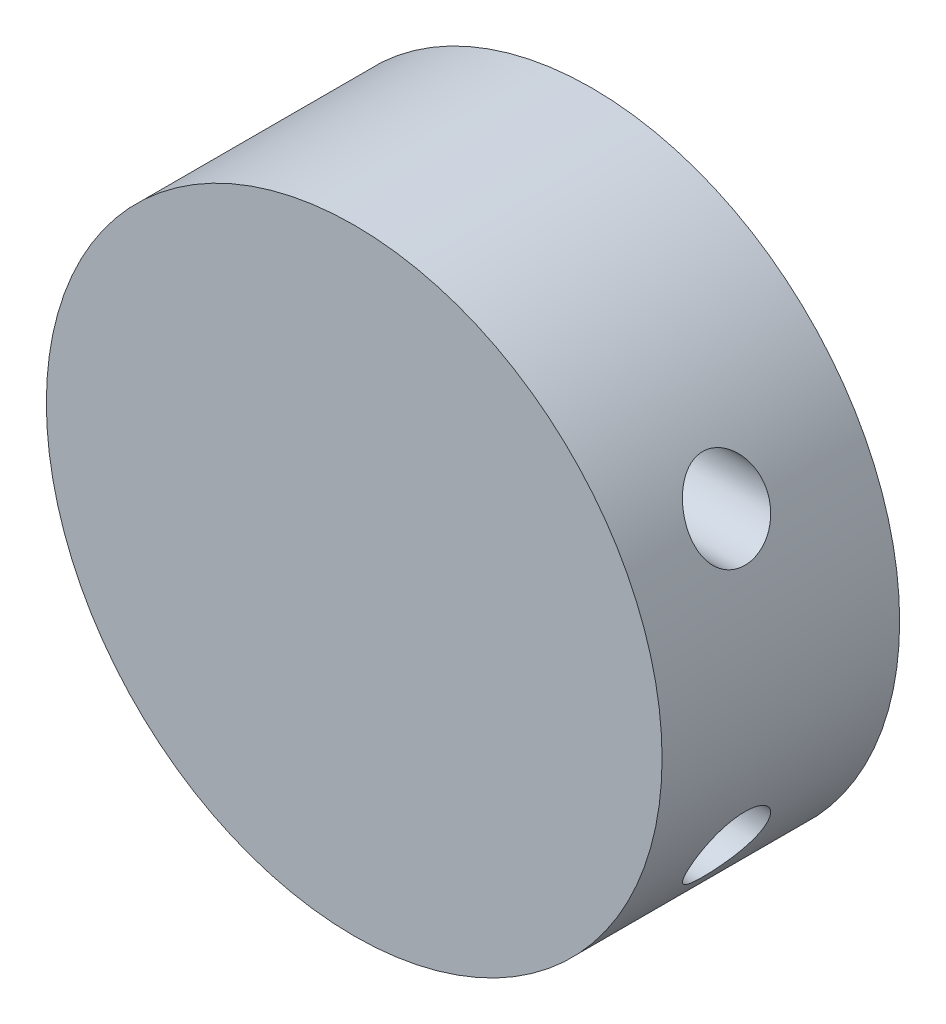
ISO-10303-21;
HEADER;
FILE_DESCRIPTION(('STEP AP214'),'2;1');
FILE_NAME('part.step','',(''),(''),'','','');
FILE_SCHEMA(('AUTOMOTIVE_DESIGN { 1 0 10303 214 1 1 1 1 }'));
ENDSEC;
DATA;
#1=APPLICATION_CONTEXT('core data for automotive mechanical design processes');
#2=APPLICATION_PROTOCOL_DEFINITION('international standard','automotive_design',2000,#1);
#3=PRODUCT_CONTEXT('',#1,'mechanical');
#4=PRODUCT('Part','Part','',(#3));
#5=PRODUCT_RELATED_PRODUCT_CATEGORY('part','',(#4));
#6=PRODUCT_DEFINITION_FORMATION('','',#4);
#7=PRODUCT_DEFINITION_CONTEXT('part definition',#1,'design');
#8=PRODUCT_DEFINITION('design','',#6,#7);
#9=PRODUCT_DEFINITION_SHAPE('','',#8);
#10=(LENGTH_UNIT() NAMED_UNIT(*) SI_UNIT(.MILLI.,.METRE.));
#11=(NAMED_UNIT(*) PLANE_ANGLE_UNIT() SI_UNIT($,.RADIAN.));
#12=(NAMED_UNIT(*) SI_UNIT($,.STERADIAN.) SOLID_ANGLE_UNIT());
#13=UNCERTAINTY_MEASURE_WITH_UNIT(LENGTH_MEASURE(1.E-05),#10,'distance_accuracy_value','');
#14=(GEOMETRIC_REPRESENTATION_CONTEXT(3) GLOBAL_UNCERTAINTY_ASSIGNED_CONTEXT((#13)) GLOBAL_UNIT_ASSIGNED_CONTEXT((#10,
#11,#12)) REPRESENTATION_CONTEXT('',''));
#15=CARTESIAN_POINT('',(0.,0.,0.));
#16=DIRECTION('',(0.,0.,1.));
#17=DIRECTION('',(1.,0.,0.));
#18=AXIS2_PLACEMENT_3D('',#15,#16,#17);
#19=CARTESIAN_POINT('',(0.,0.,24.5));
#20=DIRECTION('',(0.,0.,-1.));
#21=DIRECTION('',(-1.,0.,0.));
#22=AXIS2_PLACEMENT_3D('',#19,#20,#21);
#23=CYLINDRICAL_SURFACE('',#22,31.75);
#24=CARTESIAN_POINT('',(0.,0.,24.5));
#25=DIRECTION('',(0.,0.,1.));
#26=DIRECTION('',(1.,0.,0.));
#27=AXIS2_PLACEMENT_3D('',#24,#25,#26);
#28=CIRCLE('',#27,31.75);
#29=CARTESIAN_POINT('',(31.75,0.,24.5));
#30=VERTEX_POINT('',#29);
#31=EDGE_CURVE('E10',#30,#30,#28,.T.);
#32=ORIENTED_EDGE('',*,*,#31,.F.);
#33=EDGE_LOOP('',(#32));
#34=FACE_BOUND('',#33,.T.);
#35=CARTESIAN_POINT('',(0.,0.,0.));
#36=DIRECTION('',(0.,0.,1.));
#37=DIRECTION('',(1.,0.,0.));
#38=AXIS2_PLACEMENT_3D('',#35,#36,#37);
#39=CIRCLE('',#38,31.75);
#40=CARTESIAN_POINT('',(31.75,0.,0.));
#41=VERTEX_POINT('',#40);
#42=EDGE_CURVE('E42',#41,#41,#39,.T.);
#43=ORIENTED_EDGE('',*,*,#42,.T.);
#44=EDGE_LOOP('',(#43));
#45=FACE_BOUND('',#44,.T.);
#46=CARTESIAN_POINT('',(27.983253920872,-15.,18.));
#47=CARTESIAN_POINT('',(27.9025685609279,-15.1505226839203,18.000000745321));
#48=CARTESIAN_POINT('',(27.8206652167722,-15.3003911362479,17.9915024795788));
#49=CARTESIAN_POINT('',(27.6552134558528,-15.5974548326575,17.9579548998946));
#50=CARTESIAN_POINT('',(27.5716640089156,-15.744648284257,17.9328948799397));
#51=CARTESIAN_POINT('',(27.403683556265,-16.0352378107507,17.8665926407637));
#52=CARTESIAN_POINT('',(27.3192511021226,-16.1786255447361,17.8253175810643));
#53=CARTESIAN_POINT('',(27.1505952914782,-16.4600912477868,17.7269783409677));
#54=CARTESIAN_POINT('',(27.0663720209919,-16.5981672908071,17.6699084936374));
#55=CARTESIAN_POINT('',(26.9109084405519,-16.8488607815654,17.5494014977869));
#56=CARTESIAN_POINT('',(26.8394992879573,-16.9623386375056,17.4879701105564));
#57=CARTESIAN_POINT('',(26.6984205772957,-17.1835415895941,17.3539358473513));
#58=CARTESIAN_POINT('',(26.6287507271468,-17.2912676551502,17.2813348619597));
#59=CARTESIAN_POINT('',(26.4237974042887,-17.6041786748361,17.0472805008571));
#60=CARTESIAN_POINT('',(26.2921203669234,-17.7998164540317,16.8692326681987));
#61=CARTESIAN_POINT('',(26.0754934361883,-18.1151584304889,16.5175057728807));
#62=CARTESIAN_POINT('',(25.9868013841631,-18.2419376557834,16.3524568113533));
#63=CARTESIAN_POINT('',(25.8651725186558,-18.4135896956888,16.087698752225));
#64=CARTESIAN_POINT('',(25.8265180612673,-18.4677386707477,15.9965424781531));
#65=CARTESIAN_POINT('',(25.7536404359573,-18.5692327146883,15.8088528663841));
#66=CARTESIAN_POINT('',(25.7194153572493,-18.6165807184111,15.7123218731598));
#67=CARTESIAN_POINT('',(25.6557210681609,-18.7042627557359,15.5133953969736));
#68=CARTESIAN_POINT('',(25.6263008014813,-18.7445248966951,15.4109524125912));
#69=CARTESIAN_POINT('',(25.5732808114623,-18.8167962017821,15.2017900649057));
#70=CARTESIAN_POINT('',(25.5496778207859,-18.8488099991437,15.0950731414449));
#71=CARTESIAN_POINT('',(25.5088759044106,-18.9039924330845,14.8782627285484));
#72=CARTESIAN_POINT('',(25.4916720049353,-18.9271679396956,14.7681719338469));
#73=CARTESIAN_POINT('',(25.4641195473401,-18.9642203601435,14.5455977202115));
#74=CARTESIAN_POINT('',(25.4537696438514,-18.9780990988463,14.4331147753088));
#75=CARTESIAN_POINT('',(25.4412466153967,-18.9948824113686,14.2240436063526));
#76=CARTESIAN_POINT('',(25.4380748581298,-18.9991275367945,14.127619741501));
#77=CARTESIAN_POINT('',(25.4369526160902,-19.0006300874694,13.9346534726292));
#78=CARTESIAN_POINT('',(25.4390037421435,-18.9978853569279,13.8381110412193));
#79=CARTESIAN_POINT('',(25.4482864086189,-18.9854491611369,13.645778525255));
#80=CARTESIAN_POINT('',(25.4555150216979,-18.9757616213391,13.5499880464737));
#81=CARTESIAN_POINT('',(25.4749879395072,-18.9496107317144,13.3598408300195));
#82=CARTESIAN_POINT('',(25.4872341723106,-18.9331447771989,13.2654846579648));
#83=CARTESIAN_POINT('',(25.5294252790688,-18.876258495197,12.9966412587476));
#84=CARTESIAN_POINT('',(25.5654584914787,-18.8275134442355,12.8247745197619));
#85=CARTESIAN_POINT('',(25.6521391637944,-18.7092377525928,12.4924318913809));
#86=CARTESIAN_POINT('',(25.702790013045,-18.6397022911705,12.3319586545254));
#87=CARTESIAN_POINT('',(25.8216721235461,-18.4747138786583,12.0094387174265));
#88=CARTESIAN_POINT('',(25.8911508351871,-18.3773711106318,11.8488227889734));
#89=CARTESIAN_POINT('',(26.0411015530642,-18.1642648939835,11.5460715173178));
#90=CARTESIAN_POINT('',(26.1215797343534,-18.0484910922027,11.4039466430178));
#91=CARTESIAN_POINT('',(26.3056750195124,-17.7793424132441,11.1154140499756));
#92=CARTESIAN_POINT('',(26.4108524063094,-17.622948491053,10.9728178876294));
#93=CARTESIAN_POINT('',(26.6281469592581,-17.292872370362,10.7157080103998));
#94=CARTESIAN_POINT('',(26.7402686688395,-17.119178807143,10.6012129294206));
#95=CARTESIAN_POINT('',(26.9872251959044,-16.7276472718192,10.3842937489367));
#96=CARTESIAN_POINT('',(27.1227133815389,-16.5072933820903,10.2871220201538));
#97=CARTESIAN_POINT('',(27.3940655359033,-16.0529710004055,10.1336269361128));
#98=CARTESIAN_POINT('',(27.5299296667874,-15.8189952940548,10.0773254431205));
#99=CARTESIAN_POINT('',(27.8080890603159,-15.3250896647021,10.0048871202065));
#100=CARTESIAN_POINT('',(27.9501283737436,-15.0645128002677,9.99198739661785));
#101=CARTESIAN_POINT('',(28.1567594016338,-14.672474324736,10.0112760250366));
#102=CARTESIAN_POINT('',(28.2246022222955,-14.5415237137111,10.0241638036032));
#103=CARTESIAN_POINT('',(28.3576747898735,-14.2802723477587,10.0630721086346));
#104=CARTESIAN_POINT('',(28.4229058847664,-14.1499712887961,10.0890857636853));
#105=CARTESIAN_POINT('',(28.5475557372255,-13.8967136815171,10.1530413354139));
#106=CARTESIAN_POINT('',(28.6071037015466,-13.7736804331212,10.1904289906632));
#107=CARTESIAN_POINT('',(28.7229189446968,-13.5305042900113,10.2774677172693));
#108=CARTESIAN_POINT('',(28.7791878553116,-13.4103599754411,10.3271126233982));
#109=CARTESIAN_POINT('',(28.8880622351026,-13.1741894294718,10.4386149696961));
#110=CARTESIAN_POINT('',(28.9406688376727,-13.05816192952,10.5004686086324));
#111=CARTESIAN_POINT('',(29.0418677681001,-12.8315164918417,10.6362044632858));
#112=CARTESIAN_POINT('',(29.0904605919454,-12.720897886422,10.7100851894372));
#113=CARTESIAN_POINT('',(29.1784786485424,-12.5175819531621,10.8612199710076));
#114=CARTESIAN_POINT('',(29.2183318988569,-12.4242163484215,10.9373274872399));
#115=CARTESIAN_POINT('',(29.2943361317864,-12.2439347768443,11.0984971650575));
#116=CARTESIAN_POINT('',(29.3304875824913,-12.1570179949424,11.1835581917124));
#117=CARTESIAN_POINT('',(29.398890852042,-11.9906549550213,11.3620611738423));
#118=CARTESIAN_POINT('',(29.4311444623926,-11.9112052687762,11.4554992444428));
#119=CARTESIAN_POINT('',(29.4916149058034,-11.760685835208,11.6501123565021));
#120=CARTESIAN_POINT('',(29.5198320714577,-11.6896153975384,11.7512867594489));
#121=CARTESIAN_POINT('',(29.5696062207136,-11.5630904285695,11.9505554105786));
#122=CARTESIAN_POINT('',(29.5915419156502,-11.506792739811,12.0480209299535));
#123=CARTESIAN_POINT('',(29.6319433010523,-11.4023495136712,12.2479628148692));
#124=CARTESIAN_POINT('',(29.6504078489623,-11.3542066610331,12.3504408163699));
#125=CARTESIAN_POINT('',(29.6837881010453,-11.2666507747324,12.5595340992993));
#126=CARTESIAN_POINT('',(29.6987062320102,-11.2272317726738,12.6661464931451));
#127=CARTESIAN_POINT('',(29.7249728035396,-11.1575034253398,12.8827839451613));
#128=CARTESIAN_POINT('',(29.736319979731,-11.1271973068446,12.9928101969671));
#129=CARTESIAN_POINT('',(29.7548589944297,-11.0775235160416,13.208950293617));
#130=CARTESIAN_POINT('',(29.7622520868387,-11.0576275047487,13.3149258220681));
#131=CARTESIAN_POINT('',(29.7738207543592,-11.0264398436917,13.5283502451209));
#132=CARTESIAN_POINT('',(29.7779951862433,-11.0151512511897,13.6357996494455));
#133=CARTESIAN_POINT('',(29.7831120130678,-11.001308712165,13.8512788301679));
#134=CARTESIAN_POINT('',(29.7840561117936,-10.9987501611292,13.9593082705108));
#135=CARTESIAN_POINT('',(29.7827149194986,-11.0023813758627,14.1752402811798));
#136=CARTESIAN_POINT('',(29.7804284456712,-11.0085743458183,14.2831427905541));
#137=CARTESIAN_POINT('',(29.7727142769311,-11.0294199362792,14.4956193813924));
#138=CARTESIAN_POINT('',(29.7673565649953,-11.0438840680556,14.6002145638465));
#139=CARTESIAN_POINT('',(29.7535625950551,-11.0809929337319,14.807776119508));
#140=CARTESIAN_POINT('',(29.7451252303747,-11.1036406083664,14.9107418932906));
#141=CARTESIAN_POINT('',(29.7251939447272,-11.1568880759486,15.1142479229239));
#142=CARTESIAN_POINT('',(29.7137012603514,-11.1874846515931,15.2147891421577));
#143=CARTESIAN_POINT('',(29.6876796936301,-11.2563550546834,15.412841276776));
#144=CARTESIAN_POINT('',(29.6731496820888,-11.2946317371711,15.51035104962));
#145=CARTESIAN_POINT('',(29.6409818013423,-11.3787845564223,15.7023069794758));
#146=CARTESIAN_POINT('',(29.623323727467,-11.4247099746685,15.7967281816112));
#147=CARTESIAN_POINT('',(29.5850166472324,-11.5235455162496,15.9812209170575));
#148=CARTESIAN_POINT('',(29.5643665581427,-11.5764581674607,16.0712908599628));
#149=CARTESIAN_POINT('',(29.4980218200964,-11.7449462026514,16.3340546748087));
#150=CARTESIAN_POINT('',(29.4479014993056,-11.8703545215883,16.4994898303098));
#151=CARTESIAN_POINT('',(29.3346321996728,-12.1476336239452,16.8123451454484));
#152=CARTESIAN_POINT('',(29.2710875142165,-12.3002790130661,16.9589286952724));
#153=CARTESIAN_POINT('',(29.1330749070288,-12.6236815843172,17.2244218519287));
#154=CARTESIAN_POINT('',(29.0586020187287,-12.7944469916768,17.3433188120696));
#155=CARTESIAN_POINT('',(28.8947147232991,-13.1605763997657,17.5587354275438));
#156=CARTESIAN_POINT('',(28.8046367454029,-13.3568207736945,17.6532465135819));
#157=CARTESIAN_POINT('',(28.6152583015158,-13.7578551954455,17.8083153384002));
#158=CARTESIAN_POINT('',(28.5159636237214,-13.9626398359647,17.8688942210697));
#159=CARTESIAN_POINT('',(28.3442877725476,-14.306911648627,17.9420220595738));
#160=CARTESIAN_POINT('',(28.2739070604564,-14.4455215400728,17.9638379173528));
#161=CARTESIAN_POINT('',(28.1304452022894,-14.7229382376368,17.9928285238733));
#162=CARTESIAN_POINT('',(28.0573633317726,-14.8617450868381,17.9999993154235));
#163=CARTESIAN_POINT('',(27.983253920872,-15.,18.));
#164=B_SPLINE_CURVE_WITH_KNOTS('',3,(#46,#47,#48,#49,#50,#51,#52,#53,#54,#55,#56,#57,#58,#59,
#60,#61,#62,#63,#64,#65,#66,#67,#68,#69,#70,#71,#72,#73,#74,#75,#76,#77,#78,#79,#80,#81,#82,#83,
#84,#85,#86,#87,#88,#89,#90,#91,#92,#93,#94,#95,#96,#97,#98,#99,#100,#101,#102,#103,#104,#105,
#106,#107,#108,#109,#110,#111,#112,#113,#114,#115,#116,#117,#118,#119,#120,#121,#122,#123,#124,
#125,#126,#127,#128,#129,#130,#131,#132,#133,#134,#135,#136,#137,#138,#139,#140,#141,#142,#143,
#144,#145,#146,#147,#148,#149,#150,#151,#152,#153,#154,#155,#156,#157,#158,#159,#160,#161,#162,
#163),.UNSPECIFIED.,.T.,.F.,(4,2,2,2,2,2,2,2,2,2,2,2,2,2,2,2,2,2,2,2,2,2,2,2,2,2,2,2,2,2,2,2,2,
2,2,2,2,2,2,2,2,2,2,2,2,2,2,2,2,2,2,2,2,2,2,2,2,2,4),(0.,0.512145682780004,1.02462275607988,
1.53814314989054,2.05184802650126,2.49373150312985,2.93554026801535,3.81644666436931,
4.49230386533088,4.83050028152107,5.16855031361866,5.50985394214218,5.85096543462081,
6.19181123697165,6.53259011495339,6.82191631443433,7.11133175784701,7.40058369526178,
7.68994688516818,8.23417306504126,8.77852553442893,9.37701607892538,9.97584400407153,
10.6821747114299,11.3889725308195,12.2144135750496,13.0402958386649,13.9265537859207,
14.3701929328498,14.8136000746642,15.2381522796647,15.6624913742568,16.0866985571714,
16.5108532415534,16.8909724153255,17.2710434637871,17.650939156215,18.0308035280305,
18.3743873976925,18.7180841634489,19.0615450581663,19.4051274261024,19.7289732599804,
20.0529340668829,20.3767239796894,20.7006324721233,21.0174380134379,21.334357511392,
21.6511489360574,21.9680583452961,22.2870947765286,22.6062469482199,23.2439372094912,
23.9040204210814,24.5644045568751,25.2686123169212,25.9723807803427,26.4426589493035,
26.9130641736513),.UNSPECIFIED.);
#165=CARTESIAN_POINT('',(27.983253920872,-15.,18.));
#166=VERTEX_POINT('',#165);
#167=EDGE_CURVE('E51',#166,#166,#164,.T.);
#168=ORIENTED_EDGE('',*,*,#167,.F.);
#169=EDGE_LOOP('',(#168));
#170=FACE_BOUND('',#169,.T.);
#171=CARTESIAN_POINT('',(27.983253920872,15.,18.));
#172=CARTESIAN_POINT('',(28.110024063581,14.7634989608182,17.9999868339635));
#173=CARTESIAN_POINT('',(28.2338105799066,14.525294774704,17.9789807888524));
#174=CARTESIAN_POINT('',(28.4125711338164,14.1706038907645,17.9149187398641));
#175=CARTESIAN_POINT('',(28.4710291307731,14.0527578963364,17.8881201413677));
#176=CARTESIAN_POINT('',(28.5853019278336,13.8188241573763,17.8235487481845));
#177=CARTESIAN_POINT('',(28.6411178261389,13.7027356962095,17.7857805604816));
#178=CARTESIAN_POINT('',(28.7500406520863,13.472711477795,17.6989974437475));
#179=CARTESIAN_POINT('',(28.8031322041516,13.358789828846,17.6499257809249));
#180=CARTESIAN_POINT('',(28.9059408880612,13.1348487065598,17.5407229579492));
#181=CARTESIAN_POINT('',(28.9556595313486,13.024827496081,17.4805967968736));
#182=CARTESIAN_POINT('',(29.051430349055,12.8097912104603,17.3494543522207));
#183=CARTESIAN_POINT('',(29.0974827116635,12.7047758784785,17.278438628151));
#184=CARTESIAN_POINT('',(29.185635050276,12.5009414084511,17.1258453496361));
#185=CARTESIAN_POINT('',(29.2277354395702,12.4021216228462,17.0442689017396));
#186=CARTESIAN_POINT('',(29.3042102109787,12.2202547747555,16.8786773252094));
#187=CARTESIAN_POINT('',(29.3389384577841,12.1365849806085,16.7955086068094));
#188=CARTESIAN_POINT('',(29.4047325774504,11.9762977443477,16.6213032037163));
#189=CARTESIAN_POINT('',(29.4357988398192,11.8996795523788,16.5302673576006));
#190=CARTESIAN_POINT('',(29.4941193022555,11.7543845374438,16.3409847840087));
#191=CARTESIAN_POINT('',(29.5213750442493,11.685704504264,16.2427409979056));
#192=CARTESIAN_POINT('',(29.5719740971061,11.5570596871783,16.0397540958425));
#193=CARTESIAN_POINT('',(29.5953176819074,11.4970942930921,15.9350114356532));
#194=CARTESIAN_POINT('',(29.6361839942892,11.3913140044104,15.7290531073933));
#195=CARTESIAN_POINT('',(29.6540331588801,11.3447288808898,15.6282968979135));
#196=CARTESIAN_POINT('',(29.6863367423194,11.2599277188471,15.4227514452566));
#197=CARTESIAN_POINT('',(29.7007900408251,11.2217144425922,15.3179608843248));
#198=CARTESIAN_POINT('',(29.726246149999,11.1541066535531,15.105238663016));
#199=CARTESIAN_POINT('',(29.7372511468379,11.1247065538636,14.9973090403869));
#200=CARTESIAN_POINT('',(29.7557992665103,11.074999582012,14.7790399214324));
#201=CARTESIAN_POINT('',(29.7633411485492,11.0546959690804,14.6686995761826));
#202=CARTESIAN_POINT('',(29.7746654162812,11.0241576019477,14.4517767488621));
#203=CARTESIAN_POINT('',(29.77860857687,11.0134924863425,14.3452629978575));
#204=CARTESIAN_POINT('',(29.7833244000709,11.0007333699727,14.1316136393436));
#205=CARTESIAN_POINT('',(29.784095932022,10.9986424258342,14.0244778237007));
#206=CARTESIAN_POINT('',(29.7824640231054,11.0030605816196,13.81046090868));
#207=CARTESIAN_POINT('',(29.780062145775,11.0095654463925,13.7035797098385));
#208=CARTESIAN_POINT('',(29.7720898778217,11.0311058083552,13.4907615982544));
#209=CARTESIAN_POINT('',(29.7665183207613,11.0461444459555,13.3848250477255));
#210=CARTESIAN_POINT('',(29.752315784504,11.0843410165207,13.1761671918508));
#211=CARTESIAN_POINT('',(29.7437286762221,11.1073824726021,13.0734216407715));
#212=CARTESIAN_POINT('',(29.723503320033,11.1613920490989,12.8703311420509));
#213=CARTESIAN_POINT('',(29.7118639730475,11.1923630247535,12.76998707339));
#214=CARTESIAN_POINT('',(29.6724045645241,11.2967476660104,12.473678765059));
#215=CARTESIAN_POINT('',(29.6400283603518,11.3816736397113,12.2822194009476));
#216=CARTESIAN_POINT('',(29.5629547170813,11.5803993237634,11.9141515753605));
#217=CARTESIAN_POINT('',(29.5180882265125,11.6945933515952,11.7377937034591));
#218=CARTESIAN_POINT('',(29.4167818292426,11.9471301803316,11.4070728941998));
#219=CARTESIAN_POINT('',(29.3603403071737,12.085476351417,11.252713031903));
#220=CARTESIAN_POINT('',(29.2340048595315,12.3880349714861,10.9629977863143));
#221=CARTESIAN_POINT('',(29.1636362284424,12.5531048632077,10.8287473084036));
#222=CARTESIAN_POINT('',(29.0123268621119,12.8989543562091,10.589745669667));
#223=CARTESIAN_POINT('',(28.9313831982919,13.0797383045758,10.48500270591));
#224=CARTESIAN_POINT('',(28.7539853135311,13.4654774089442,10.2994102035179));
#225=CARTESIAN_POINT('',(28.6568268577349,13.6712314784854,10.2208990234278));
#226=CARTESIAN_POINT('',(28.4538721577848,14.0887767711822,10.0990985672881));
#227=CARTESIAN_POINT('',(28.3480724744775,14.3005703759929,10.0558233908445));
#228=CARTESIAN_POINT('',(28.1193042102082,14.7457012159863,10.001202753835));
#229=CARTESIAN_POINT('',(27.9956671819748,14.9791269521217,9.99337904453762));
#230=CARTESIAN_POINT('',(27.7434964390791,15.4411892680322,10.0176701899825));
#231=CARTESIAN_POINT('',(27.6149607521993,15.669823860217,10.0498012989058));
#232=CARTESIAN_POINT('',(27.3443489888258,16.1377979938574,10.1570647211751));
#233=CARTESIAN_POINT('',(27.2021071468684,16.3762120776516,10.2358516090558));
#234=CARTESIAN_POINT('',(26.9201632042724,16.835681159289,10.4372293889668));
#235=CARTESIAN_POINT('',(26.7804635836181,17.0567198387207,10.5598608727324));
#236=CARTESIAN_POINT('',(26.505813139238,17.4805461353824,10.8512658655006));
#237=CARTESIAN_POINT('',(26.3710652491498,17.6827470739198,11.0211056728301));
#238=CARTESIAN_POINT('',(26.1814870120743,17.9612082378828,11.3076066515065));
#239=CARTESIAN_POINT('',(26.1204001694556,18.0498672995068,11.4083646374443));
#240=CARTESIAN_POINT('',(26.0035194382763,18.2178456800818,11.6201392095739));
#241=CARTESIAN_POINT('',(25.9477229367241,18.2971696145336,11.7311506773378));
#242=CARTESIAN_POINT('',(25.8218339736325,18.4746167635338,12.0090575185729));
#243=CARTESIAN_POINT('',(25.7548299718237,18.5677454139511,12.1806746775842));
#244=CARTESIAN_POINT('',(25.6668953530451,18.6889134521664,12.4502701203306));
#245=CARTESIAN_POINT('',(25.6396764257439,18.7262188162693,12.5421758109962));
#246=CARTESIAN_POINT('',(25.5898790533649,18.7942108910002,12.7296128642886));
#247=CARTESIAN_POINT('',(25.5672986827532,18.824900348252,12.8251427028885));
#248=CARTESIAN_POINT('',(25.5270769995498,18.8794067499008,13.0199436742465));
#249=CARTESIAN_POINT('',(25.5094729224684,18.9031719213601,13.1192370174565));
#250=CARTESIAN_POINT('',(25.4798188049375,18.943124187278,13.3201101124791));
#251=CARTESIAN_POINT('',(25.4677660970445,18.9593149213268,13.4216887415461));
#252=CARTESIAN_POINT('',(25.4494924109247,18.9838371094687,13.6262945484276));
#253=CARTESIAN_POINT('',(25.4432703688291,18.9921699973135,13.7293214585041));
#254=CARTESIAN_POINT('',(25.436809943817,19.0008218220224,13.9358923765535));
#255=CARTESIAN_POINT('',(25.4365709703528,19.0011415498109,14.0394363324832));
#256=CARTESIAN_POINT('',(25.4417789756405,18.9941674686284,14.2347220999792));
#257=CARTESIAN_POINT('',(25.446604430457,18.9877058884476,14.3265112871216));
#258=CARTESIAN_POINT('',(25.4608967890643,18.9685362804235,14.5090786601736));
#259=CARTESIAN_POINT('',(25.4703651619797,18.9558262754336,14.5998565167709));
#260=CARTESIAN_POINT('',(25.5054886711062,18.9085736144341,14.869647662142));
#261=CARTESIAN_POINT('',(25.5378675679415,18.8649013082837,15.0463016561587));
#262=CARTESIAN_POINT('',(25.6186412626291,18.7550615220768,15.3901240546947));
#263=CARTESIAN_POINT('',(25.6671696192398,18.6887063217501,15.5571992598075));
#264=CARTESIAN_POINT('',(25.7773437889515,18.5364470049031,15.8775000599248));
#265=CARTESIAN_POINT('',(25.8389943768252,18.4505357717568,16.0307205846477));
#266=CARTESIAN_POINT('',(25.981979699861,18.2487407201334,16.3419546924786));
#267=CARTESIAN_POINT('',(26.0648629865138,18.1303418433901,16.4976182740952));
#268=CARTESIAN_POINT('',(26.2402680648917,17.8755363675836,16.787211616849));
#269=CARTESIAN_POINT('',(26.3327957868031,17.739118675143,16.921127874973));
#270=CARTESIAN_POINT('',(26.5421770943509,17.4246160818796,17.1892792503516));
#271=CARTESIAN_POINT('',(26.6603531984929,17.2435014896017,17.3189357931025));
#272=CARTESIAN_POINT('',(26.9015341732812,16.8647705472486,17.5456181584395));
#273=CARTESIAN_POINT('',(27.0245424567973,16.6671424187905,17.6426204378645));
#274=CARTESIAN_POINT('',(27.2886771509321,16.2315685778887,17.8138097663917));
#275=CARTESIAN_POINT('',(27.4299924346736,15.9917950309993,17.8830996907418));
#276=CARTESIAN_POINT('',(27.7097518480181,15.5019916646946,17.9762006163523));
#277=CARTESIAN_POINT('',(27.8481961293306,15.2519623893025,18.0000140267715));
#278=CARTESIAN_POINT('',(27.983253920872,15.,18.));
#279=B_SPLINE_CURVE_WITH_KNOTS('',3,(#171,#172,#173,#174,#175,#176,#177,#178,#179,#180,#181,
#182,#183,#184,#185,#186,#187,#188,#189,#190,#191,#192,#193,#194,#195,#196,#197,#198,#199,#200,
#201,#202,#203,#204,#205,#206,#207,#208,#209,#210,#211,#212,#213,#214,#215,#216,#217,#218,#219,
#220,#221,#222,#223,#224,#225,#226,#227,#228,#229,#230,#231,#232,#233,#234,#235,#236,#237,#238,
#239,#240,#241,#242,#243,#244,#245,#246,#247,#248,#249,#250,#251,#252,#253,#254,#255,#256,#257,
#258,#259,#260,#261,#262,#263,#264,#265,#266,#267,#268,#269,#270,#271,#272,#273,#274,#275,#276,
#277,#278),.UNSPECIFIED.,.T.,.F.,(4,2,2,2,2,2,2,2,2,2,2,2,2,2,2,2,2,2,2,2,2,2,2,2,2,2,2,2,2,2,2,
2,2,2,2,2,2,2,2,2,2,2,2,2,2,2,2,2,2,2,2,2,2,4),(0.,0.80398476106776,1.20633359813782,
1.60851370136571,2.01275817182418,2.41682028204419,2.82086163843696,3.22486069373715,
3.59330594846399,3.96171197798937,4.32996849791796,4.69819922087552,5.0350662746742,
5.37204430996587,5.70880827202939,6.04569279880679,6.36666213928111,6.6877458929069,
7.00867150768442,7.32971529907084,7.6462697713099,7.96293838829929,8.59561418322521,
9.23730828726812,9.87909200473834,10.5485181631683,11.2181301025269,11.9372367564286,
12.6566310179914,13.4461166627004,14.2359235863543,15.0977633100088,15.9604030078593,
16.8443801794565,17.2861222122382,17.7276449117884,18.3440087645079,18.6522678272365,
18.9603986673058,19.2707775219929,19.5810070830684,19.8911800283426,20.2013223584446,
20.4774062459539,20.7535775490987,21.3053771643971,21.8618586197714,22.4185429086972,
23.0534240932388,23.6886979835641,24.4421958869137,25.1962358915331,26.0528268581611,
26.9093724448621),.UNSPECIFIED.);
#280=CARTESIAN_POINT('',(27.983253920872,15.,18.));
#281=VERTEX_POINT('',#280);
#282=EDGE_CURVE('E35',#281,#281,#279,.T.);
#283=ORIENTED_EDGE('',*,*,#282,.F.);
#284=EDGE_LOOP('',(#283));
#285=FACE_BOUND('',#284,.T.);
#286=ADVANCED_FACE('F31',(#34,#45,#170,#285),#23,.T.);
#287=CARTESIAN_POINT('',(0.,0.,24.5));
#288=DIRECTION('',(0.,0.,1.));
#289=DIRECTION('',(1.,0.,0.));
#290=AXIS2_PLACEMENT_3D('',#287,#288,#289);
#291=PLANE('',#290);
#292=ORIENTED_EDGE('',*,*,#31,.T.);
#293=EDGE_LOOP('',(#292));
#294=FACE_BOUND('',#293,.T.);
#295=ADVANCED_FACE('F65',(#294),#291,.T.);
#296=CARTESIAN_POINT('',(0.,0.,0.));
#297=DIRECTION('',(0.,0.,1.));
#298=DIRECTION('',(1.,0.,0.));
#299=AXIS2_PLACEMENT_3D('',#296,#297,#298);
#300=PLANE('',#299);
#301=ORIENTED_EDGE('',*,*,#42,.F.);
#302=EDGE_LOOP('',(#301));
#303=FACE_BOUND('',#302,.T.);
#304=ADVANCED_FACE('F63',(#303),#300,.F.);
#305=CARTESIAN_POINT('',(31.75,-15.,14.));
#306=DIRECTION('',(-1.,0.,0.));
#307=DIRECTION('',(0.,0.,1.));
#308=AXIS2_PLACEMENT_3D('',#305,#306,#307);
#309=CYLINDRICAL_SURFACE('',#308,4.);
#310=CARTESIAN_POINT('',(20.,-15.,14.));
#311=DIRECTION('',(1.,0.,0.));
#312=DIRECTION('',(0.,0.,-1.));
#313=AXIS2_PLACEMENT_3D('',#310,#311,#312);
#314=CIRCLE('',#313,4.);
#315=CARTESIAN_POINT('',(20.,-15.,10.));
#316=VERTEX_POINT('',#315);
#317=EDGE_CURVE('E49',#316,#316,#314,.T.);
#318=ORIENTED_EDGE('',*,*,#317,.F.);
#319=EDGE_LOOP('',(#318));
#320=FACE_BOUND('',#319,.T.);
#321=ORIENTED_EDGE('',*,*,#167,.T.);
#322=EDGE_LOOP('',(#321));
#323=FACE_BOUND('',#322,.T.);
#324=ADVANCED_FACE('F57',(#320,#323),#309,.F.);
#325=CARTESIAN_POINT('',(20.,-15.,14.));
#326=DIRECTION('',(1.,0.,0.));
#327=DIRECTION('',(0.,0.,-1.));
#328=AXIS2_PLACEMENT_3D('',#325,#326,#327);
#329=PLANE('',#328);
#330=ORIENTED_EDGE('',*,*,#317,.T.);
#331=EDGE_LOOP('',(#330));
#332=FACE_BOUND('',#331,.T.);
#333=ADVANCED_FACE('F62',(#332),#329,.T.);
#334=CARTESIAN_POINT('',(31.75,15.,14.));
#335=DIRECTION('',(-1.,0.,0.));
#336=DIRECTION('',(0.,0.,1.));
#337=AXIS2_PLACEMENT_3D('',#334,#335,#336);
#338=CYLINDRICAL_SURFACE('',#337,4.);
#339=CARTESIAN_POINT('',(20.,15.,14.));
#340=DIRECTION('',(1.,0.,0.));
#341=DIRECTION('',(0.,0.,-1.));
#342=AXIS2_PLACEMENT_3D('',#339,#340,#341);
#343=CIRCLE('',#342,4.);
#344=CARTESIAN_POINT('',(20.,15.,10.));
#345=VERTEX_POINT('',#344);
#346=EDGE_CURVE('E56',#345,#345,#343,.T.);
#347=ORIENTED_EDGE('',*,*,#346,.F.);
#348=EDGE_LOOP('',(#347));
#349=FACE_BOUND('',#348,.T.);
#350=ORIENTED_EDGE('',*,*,#282,.T.);
#351=EDGE_LOOP('',(#350));
#352=FACE_BOUND('',#351,.T.);
#353=ADVANCED_FACE('F83',(#349,#352),#338,.F.);
#354=CARTESIAN_POINT('',(20.,15.,14.));
#355=DIRECTION('',(1.,0.,0.));
#356=DIRECTION('',(0.,0.,-1.));
#357=AXIS2_PLACEMENT_3D('',#354,#355,#356);
#358=PLANE('',#357);
#359=ORIENTED_EDGE('',*,*,#346,.T.);
#360=EDGE_LOOP('',(#359));
#361=FACE_BOUND('',#360,.T.);
#362=ADVANCED_FACE('F85',(#361),#358,.T.);
#363=CLOSED_SHELL('',(#286,#295,#304,#324,#333,#353,#362));
#364=MANIFOLD_SOLID_BREP('B2',#363);
#365=ADVANCED_BREP_SHAPE_REPRESENTATION('',(#18,#364),#14);
#366=SHAPE_DEFINITION_REPRESENTATION(#9,#365);
ENDSEC;
END-ISO-10303-21;
